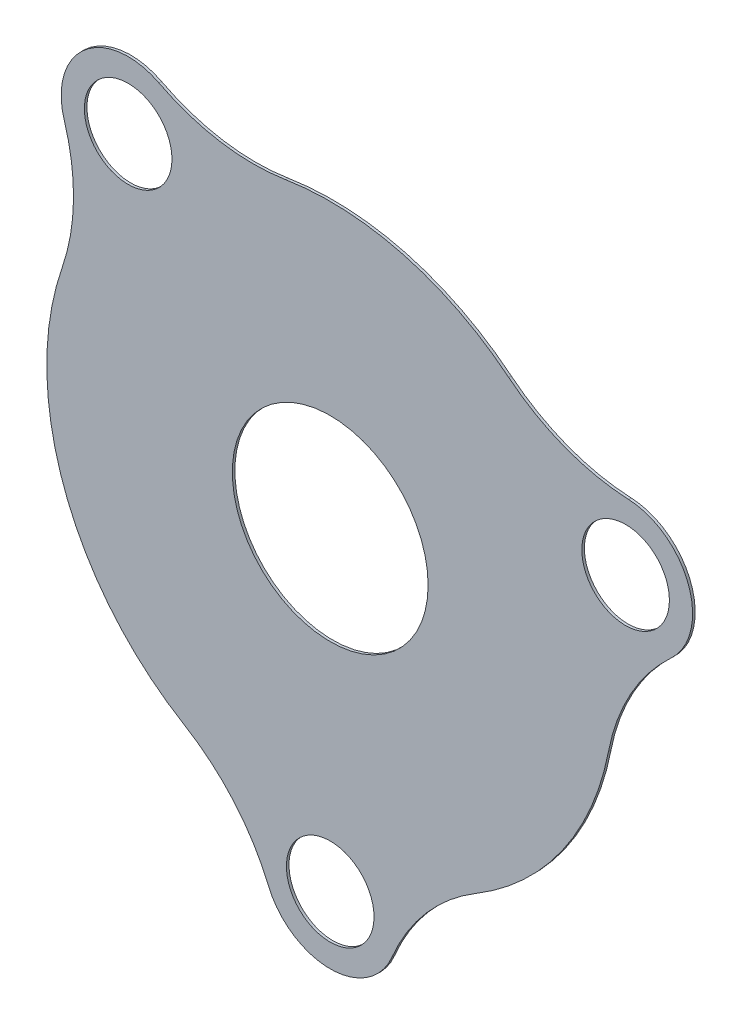
ISO-10303-21;
HEADER;
FILE_DESCRIPTION(('STEP AP214'),'2;1');
FILE_NAME('part.step','',(''),(''),'','','');
FILE_SCHEMA(('AUTOMOTIVE_DESIGN { 1 0 10303 214 1 1 1 1 }'));
ENDSEC;
DATA;
#1=APPLICATION_CONTEXT('core data for automotive mechanical design processes');
#2=APPLICATION_PROTOCOL_DEFINITION('international standard','automotive_design',2000,#1);
#3=PRODUCT_CONTEXT('',#1,'mechanical');
#4=PRODUCT('Part','Part','',(#3));
#5=PRODUCT_RELATED_PRODUCT_CATEGORY('part','',(#4));
#6=PRODUCT_DEFINITION_FORMATION('','',#4);
#7=PRODUCT_DEFINITION_CONTEXT('part definition',#1,'design');
#8=PRODUCT_DEFINITION('design','',#6,#7);
#9=PRODUCT_DEFINITION_SHAPE('','',#8);
#10=(LENGTH_UNIT() NAMED_UNIT(*) SI_UNIT(.MILLI.,.METRE.));
#11=(NAMED_UNIT(*) PLANE_ANGLE_UNIT() SI_UNIT($,.RADIAN.));
#12=(NAMED_UNIT(*) SI_UNIT($,.STERADIAN.) SOLID_ANGLE_UNIT());
#13=UNCERTAINTY_MEASURE_WITH_UNIT(LENGTH_MEASURE(1.E-05),#10,'distance_accuracy_value','');
#14=(GEOMETRIC_REPRESENTATION_CONTEXT(3) GLOBAL_UNCERTAINTY_ASSIGNED_CONTEXT((#13)) GLOBAL_UNIT_ASSIGNED_CONTEXT((#10,
#11,#12)) REPRESENTATION_CONTEXT('',''));
#15=CARTESIAN_POINT('',(0.,0.,0.));
#16=DIRECTION('',(0.,0.,1.));
#17=DIRECTION('',(1.,0.,0.));
#18=AXIS2_PLACEMENT_3D('',#15,#16,#17);
#19=CARTESIAN_POINT('',(-24.4477196009052,-40.7254098360657,0.5));
#20=DIRECTION('',(0.,0.,1.));
#21=DIRECTION('',(1.,0.,0.));
#22=AXIS2_PLACEMENT_3D('',#19,#20,#21);
#23=PLANE('',#22);
#24=CARTESIAN_POINT('',(0.,-60.9999999999992,0.5));
#25=DIRECTION('',(0.,0.,1.));
#26=DIRECTION('',(1.,0.,0.));
#27=AXIS2_PLACEMENT_3D('',#24,#25,#26);
#28=CIRCLE('',#27,8.50000000000002);
#29=CARTESIAN_POINT('',(8.50000000000003,-60.9999999999992,0.5));
#30=VERTEX_POINT('',#29);
#31=EDGE_CURVE('E299',#30,#30,#28,.T.);
#32=ORIENTED_EDGE('',*,*,#31,.F.);
#33=EDGE_LOOP('',(#32));
#34=FACE_BOUND('',#33,.T.);
#35=CARTESIAN_POINT('',(57.3212498679402,20.863228742866,0.5));
#36=DIRECTION('',(0.,0.,1.));
#37=DIRECTION('',(1.,0.,0.));
#38=AXIS2_PLACEMENT_3D('',#35,#36,#37);
#39=CIRCLE('',#38,8.50000000000002);
#40=CARTESIAN_POINT('',(65.8212498679402,20.863228742866,0.5));
#41=VERTEX_POINT('',#40);
#42=EDGE_CURVE('E166',#41,#41,#39,.T.);
#43=ORIENTED_EDGE('',*,*,#42,.F.);
#44=EDGE_LOOP('',(#43));
#45=FACE_BOUND('',#44,.T.);
#46=CARTESIAN_POINT('',(-48.8954392018104,-81.4508196721313,0.5));
#47=DIRECTION('',(0.,0.,-1.));
#48=DIRECTION('',(1.,0.,0.));
#49=AXIS2_PLACEMENT_3D('',#46,#47,#48);
#50=CIRCLE('',#49,40.);
#51=CARTESIAN_POINT('',(-28.3078858536797,-47.155737704918,0.5));
#52=VERTEX_POINT('',#51);
#53=CARTESIAN_POINT('',(-11.9932209362931,-66.0162387875033,0.5));
#54=VERTEX_POINT('',#53);
#55=EDGE_CURVE('E185',#52,#54,#50,.T.);
#56=ORIENTED_EDGE('',*,*,#55,.T.);
#57=CARTESIAN_POINT('',(0.,-60.9999999999992,0.5));
#58=DIRECTION('',(0.,0.,1.));
#59=DIRECTION('',(1.,0.,0.));
#60=AXIS2_PLACEMENT_3D('',#57,#58,#59);
#61=CIRCLE('',#60,13.);
#62=CARTESIAN_POINT('',(11.9932209362932,-66.0162387875032,0.5));
#63=VERTEX_POINT('',#62);
#64=EDGE_CURVE('E113',#54,#63,#61,.T.);
#65=ORIENTED_EDGE('',*,*,#64,.T.);
#66=CARTESIAN_POINT('',(48.8954392018111,-81.4508196721309,0.5));
#67=DIRECTION('',(0.,0.,-1.));
#68=DIRECTION('',(1.,0.,0.));
#69=AXIS2_PLACEMENT_3D('',#66,#67,#68);
#70=CIRCLE('',#69,40.0000000000005);
#71=CARTESIAN_POINT('',(28.3078858536798,-47.1557377049174,0.5));
#72=VERTEX_POINT('',#71);
#73=EDGE_CURVE('E212',#63,#72,#70,.T.);
#74=ORIENTED_EDGE('',*,*,#73,.T.);
#75=CARTESIAN_POINT('',(0.,0.,0.5));
#76=DIRECTION('',(0.,0.,1.));
#77=DIRECTION('',(1.,0.,0.));
#78=AXIS2_PLACEMENT_3D('',#75,#76,#77);
#79=CIRCLE('',#78,54.9999999999995);
#80=CARTESIAN_POINT('',(53.9937659259491,-10.4724992782891,0.5));
#81=VERTEX_POINT('',#80);
#82=EDGE_CURVE('E231',#72,#81,#79,.T.);
#83=ORIENTED_EDGE('',*,*,#82,.T.);
#84=CARTESIAN_POINT('',(93.2619593266404,-18.0888623897722,0.5));
#85=DIRECTION('',(0.,0.,-1.));
#86=DIRECTION('',(1.,0.,0.));
#87=AXIS2_PLACEMENT_3D('',#84,#85,#86);
#88=CIRCLE('',#87,40.0000000000005);
#89=CARTESIAN_POINT('',(66.136895584225,11.3089422386341,0.5));
#90=VERTEX_POINT('',#89);
#91=EDGE_CURVE('E228',#81,#90,#88,.T.);
#92=ORIENTED_EDGE('',*,*,#91,.T.);
#93=CARTESIAN_POINT('',(57.3212498679402,20.863228742866,0.5));
#94=DIRECTION('',(0.,0.,1.));
#95=DIRECTION('',(1.,0.,0.));
#96=AXIS2_PLACEMENT_3D('',#93,#94,#95);
#97=CIRCLE('',#96,13.);
#98=CARTESIAN_POINT('',(57.9330492970901,33.8488246652136,0.5));
#99=VERTEX_POINT('',#98);
#100=EDGE_CURVE('E230',#90,#99,#97,.T.);
#101=ORIENTED_EDGE('',*,*,#100,.T.);
#102=CARTESIAN_POINT('',(59.8155090790899,73.8045044262838,0.5));
#103=DIRECTION('',(0.,0.,-1.));
#104=DIRECTION('',(1.,0.,0.));
#105=AXIS2_PLACEMENT_3D('',#102,#103,#104);
#106=CIRCLE('',#105,40.0000000000005);
#107=CARTESIAN_POINT('',(34.6300315721044,42.7289236152166,0.5));
#108=VERTEX_POINT('',#107);
#109=EDGE_CURVE('E233',#99,#108,#106,.T.);
#110=ORIENTED_EDGE('',*,*,#109,.T.);
#111=CARTESIAN_POINT('',(0.,0.,0.5));
#112=DIRECTION('',(0.,0.,1.));
#113=DIRECTION('',(1.,0.,0.));
#114=AXIS2_PLACEMENT_3D('',#111,#112,#113);
#115=CIRCLE('',#114,54.9999999999996);
#116=CARTESIAN_POINT('',(-8.62602526769196,54.3193491131945,0.5));
#117=VERTEX_POINT('',#116);
#118=EDGE_CURVE('E239',#108,#117,#115,.T.);
#119=ORIENTED_EDGE('',*,*,#118,.T.);
#120=CARTESIAN_POINT('',(-14.8994981896499,93.8243302864276,0.5));
#121=DIRECTION('',(0.,0.,-1.));
#122=DIRECTION('',(1.,0.,0.));
#123=AXIS2_PLACEMENT_3D('',#120,#121,#122);
#124=CIRCLE('',#123,40.0000000000005);
#125=CARTESIAN_POINT('',(-33.2470800773702,58.2804666968649,0.5));
#126=VERTEX_POINT('',#125);
#127=EDGE_CURVE('E144',#117,#126,#124,.T.);
#128=ORIENTED_EDGE('',*,*,#127,.T.);
#129=CARTESIAN_POINT('',(-39.2100441908792,46.7287110302572,0.5));
#130=DIRECTION('',(0.,0.,1.));
#131=DIRECTION('',(1.,0.,0.));
#132=AXIS2_PLACEMENT_3D('',#129,#130,#131);
#133=CIRCLE('',#132,13.);
#134=CARTESIAN_POINT('',(-51.6217605840612,42.8622790606998,0.5));
#135=VERTEX_POINT('',#134);
#136=EDGE_CURVE('E138',#126,#135,#133,.T.);
#137=ORIENTED_EDGE('',*,*,#136,.T.);
#138=CARTESIAN_POINT('',(-89.8116571784681,30.9655653082154,0.5));
#139=DIRECTION('',(0.,0.,-1.));
#140=DIRECTION('',(1.,0.,0.));
#141=AXIS2_PLACEMENT_3D('',#138,#139,#140);
#142=CIRCLE('',#141,40.0000000000005);
#143=CARTESIAN_POINT('',(-51.9962225770074,17.9274325468614,0.5));
#144=VERTEX_POINT('',#143);
#145=EDGE_CURVE('E142',#135,#144,#142,.T.);
#146=ORIENTED_EDGE('',*,*,#145,.T.);
#147=CARTESIAN_POINT('',(0.,0.,0.5));
#148=DIRECTION('',(0.,0.,1.));
#149=DIRECTION('',(1.,0.,0.));
#150=AXIS2_PLACEMENT_3D('',#147,#148,#149);
#151=CIRCLE('',#150,54.9999999999998);
#152=EDGE_CURVE('E58',#144,#52,#151,.T.);
#153=ORIENTED_EDGE('',*,*,#152,.T.);
#154=EDGE_LOOP('',(#56,#65,#74,#83,#92,#101,#110,#119,#128,#137,#146,#153));
#155=FACE_BOUND('',#154,.T.);
#156=CARTESIAN_POINT('',(-39.2100441908792,46.7287110302572,0.5));
#157=DIRECTION('',(0.,0.,1.));
#158=DIRECTION('',(1.,0.,0.));
#159=AXIS2_PLACEMENT_3D('',#156,#157,#158);
#160=CIRCLE('',#159,8.50000000000002);
#161=CARTESIAN_POINT('',(-30.7100441908792,46.7287110302572,0.5));
#162=VERTEX_POINT('',#161);
#163=EDGE_CURVE('E305',#162,#162,#160,.T.);
#164=ORIENTED_EDGE('',*,*,#163,.F.);
#165=EDGE_LOOP('',(#164));
#166=FACE_BOUND('',#165,.T.);
#167=CARTESIAN_POINT('',(0.,0.,0.5));
#168=DIRECTION('',(0.,0.,1.));
#169=DIRECTION('',(1.,0.,0.));
#170=AXIS2_PLACEMENT_3D('',#167,#168,#169);
#171=CIRCLE('',#170,19.);
#172=CARTESIAN_POINT('',(19.,0.,0.5));
#173=VERTEX_POINT('',#172);
#174=EDGE_CURVE('E290',#173,#173,#171,.T.);
#175=ORIENTED_EDGE('',*,*,#174,.F.);
#176=EDGE_LOOP('',(#175));
#177=FACE_BOUND('',#176,.T.);
#178=ADVANCED_FACE('F41',(#34,#45,#155,#166,#177),#23,.T.);
#179=CARTESIAN_POINT('',(-24.4477196009052,-40.7254098360657,0.));
#180=DIRECTION('',(0.,0.,1.));
#181=DIRECTION('',(1.,0.,0.));
#182=AXIS2_PLACEMENT_3D('',#179,#180,#181);
#183=PLANE('',#182);
#184=CARTESIAN_POINT('',(-48.8954392018104,-81.4508196721313,0.));
#185=DIRECTION('',(0.,0.,-1.));
#186=DIRECTION('',(1.,0.,0.));
#187=AXIS2_PLACEMENT_3D('',#184,#185,#186);
#188=CIRCLE('',#187,40.);
#189=CARTESIAN_POINT('',(-28.3078858536797,-47.155737704918,0.));
#190=VERTEX_POINT('',#189);
#191=CARTESIAN_POINT('',(-11.9932209362931,-66.0162387875033,0.));
#192=VERTEX_POINT('',#191);
#193=EDGE_CURVE('E162',#190,#192,#188,.T.);
#194=ORIENTED_EDGE('',*,*,#193,.F.);
#195=CARTESIAN_POINT('',(0.,0.,0.));
#196=DIRECTION('',(0.,0.,1.));
#197=DIRECTION('',(1.,0.,0.));
#198=AXIS2_PLACEMENT_3D('',#195,#196,#197);
#199=CIRCLE('',#198,54.9999999999998);
#200=CARTESIAN_POINT('',(-51.9962225770074,17.9274325468614,0.));
#201=VERTEX_POINT('',#200);
#202=EDGE_CURVE('E105',#201,#190,#199,.T.);
#203=ORIENTED_EDGE('',*,*,#202,.F.);
#204=CARTESIAN_POINT('',(-89.8116571784681,30.9655653082154,0.));
#205=DIRECTION('',(0.,0.,-1.));
#206=DIRECTION('',(1.,0.,0.));
#207=AXIS2_PLACEMENT_3D('',#204,#205,#206);
#208=CIRCLE('',#207,40.0000000000005);
#209=CARTESIAN_POINT('',(-51.6217605840612,42.8622790606998,0.));
#210=VERTEX_POINT('',#209);
#211=EDGE_CURVE('E99',#210,#201,#208,.T.);
#212=ORIENTED_EDGE('',*,*,#211,.F.);
#213=CARTESIAN_POINT('',(-39.2100441908792,46.7287110302572,0.));
#214=DIRECTION('',(0.,0.,1.));
#215=DIRECTION('',(1.,0.,0.));
#216=AXIS2_PLACEMENT_3D('',#213,#214,#215);
#217=CIRCLE('',#216,13.);
#218=CARTESIAN_POINT('',(-33.2470800773702,58.2804666968649,0.));
#219=VERTEX_POINT('',#218);
#220=EDGE_CURVE('E152',#219,#210,#217,.T.);
#221=ORIENTED_EDGE('',*,*,#220,.F.);
#222=CARTESIAN_POINT('',(-14.8994981896499,93.8243302864276,0.));
#223=DIRECTION('',(0.,0.,-1.));
#224=DIRECTION('',(1.,0.,0.));
#225=AXIS2_PLACEMENT_3D('',#222,#223,#224);
#226=CIRCLE('',#225,40.0000000000005);
#227=CARTESIAN_POINT('',(-8.62602526769196,54.3193491131945,0.));
#228=VERTEX_POINT('',#227);
#229=EDGE_CURVE('E180',#228,#219,#226,.T.);
#230=ORIENTED_EDGE('',*,*,#229,.F.);
#231=CARTESIAN_POINT('',(0.,0.,0.));
#232=DIRECTION('',(0.,0.,1.));
#233=DIRECTION('',(1.,0.,0.));
#234=AXIS2_PLACEMENT_3D('',#231,#232,#233);
#235=CIRCLE('',#234,54.9999999999996);
#236=CARTESIAN_POINT('',(34.6300315721044,42.7289236152166,0.));
#237=VERTEX_POINT('',#236);
#238=EDGE_CURVE('E178',#237,#228,#235,.T.);
#239=ORIENTED_EDGE('',*,*,#238,.F.);
#240=CARTESIAN_POINT('',(59.8155090790899,73.8045044262838,0.));
#241=DIRECTION('',(0.,0.,-1.));
#242=DIRECTION('',(1.,0.,0.));
#243=AXIS2_PLACEMENT_3D('',#240,#241,#242);
#244=CIRCLE('',#243,40.0000000000005);
#245=CARTESIAN_POINT('',(57.9330492970901,33.8488246652136,0.));
#246=VERTEX_POINT('',#245);
#247=EDGE_CURVE('E176',#246,#237,#244,.T.);
#248=ORIENTED_EDGE('',*,*,#247,.F.);
#249=CARTESIAN_POINT('',(57.3212498679402,20.863228742866,0.));
#250=DIRECTION('',(0.,0.,1.));
#251=DIRECTION('',(1.,0.,0.));
#252=AXIS2_PLACEMENT_3D('',#249,#250,#251);
#253=CIRCLE('',#252,13.);
#254=CARTESIAN_POINT('',(66.136895584225,11.3089422386341,0.));
#255=VERTEX_POINT('',#254);
#256=EDGE_CURVE('E174',#255,#246,#253,.T.);
#257=ORIENTED_EDGE('',*,*,#256,.F.);
#258=CARTESIAN_POINT('',(93.2619593266404,-18.0888623897722,0.));
#259=DIRECTION('',(0.,0.,-1.));
#260=DIRECTION('',(1.,0.,0.));
#261=AXIS2_PLACEMENT_3D('',#258,#259,#260);
#262=CIRCLE('',#261,40.0000000000005);
#263=CARTESIAN_POINT('',(53.9937659259491,-10.4724992782891,0.));
#264=VERTEX_POINT('',#263);
#265=EDGE_CURVE('E172',#264,#255,#262,.T.);
#266=ORIENTED_EDGE('',*,*,#265,.F.);
#267=CARTESIAN_POINT('',(0.,0.,0.));
#268=DIRECTION('',(0.,0.,1.));
#269=DIRECTION('',(1.,0.,0.));
#270=AXIS2_PLACEMENT_3D('',#267,#268,#269);
#271=CIRCLE('',#270,54.9999999999995);
#272=CARTESIAN_POINT('',(28.3078858536798,-47.1557377049174,0.));
#273=VERTEX_POINT('',#272);
#274=EDGE_CURVE('E170',#273,#264,#271,.T.);
#275=ORIENTED_EDGE('',*,*,#274,.F.);
#276=CARTESIAN_POINT('',(48.8954392018111,-81.4508196721309,0.));
#277=DIRECTION('',(0.,0.,-1.));
#278=DIRECTION('',(1.,0.,0.));
#279=AXIS2_PLACEMENT_3D('',#276,#277,#278);
#280=CIRCLE('',#279,40.0000000000005);
#281=CARTESIAN_POINT('',(11.9932209362932,-66.0162387875032,0.));
#282=VERTEX_POINT('',#281);
#283=EDGE_CURVE('E168',#282,#273,#280,.T.);
#284=ORIENTED_EDGE('',*,*,#283,.F.);
#285=CARTESIAN_POINT('',(0.,-60.9999999999992,0.));
#286=DIRECTION('',(0.,0.,1.));
#287=DIRECTION('',(1.,0.,0.));
#288=AXIS2_PLACEMENT_3D('',#285,#286,#287);
#289=CIRCLE('',#288,13.);
#290=EDGE_CURVE('E165',#192,#282,#289,.T.);
#291=ORIENTED_EDGE('',*,*,#290,.F.);
#292=EDGE_LOOP('',(#194,#203,#212,#221,#230,#239,#248,#257,#266,#275,#284,#291));
#293=FACE_BOUND('',#292,.T.);
#294=CARTESIAN_POINT('',(57.3212498679402,20.863228742866,0.));
#295=DIRECTION('',(0.,0.,1.));
#296=DIRECTION('',(1.,0.,0.));
#297=AXIS2_PLACEMENT_3D('',#294,#295,#296);
#298=CIRCLE('',#297,8.50000000000002);
#299=CARTESIAN_POINT('',(65.8212498679402,20.863228742866,0.));
#300=VERTEX_POINT('',#299);
#301=EDGE_CURVE('E308',#300,#300,#298,.T.);
#302=ORIENTED_EDGE('',*,*,#301,.T.);
#303=EDGE_LOOP('',(#302));
#304=FACE_BOUND('',#303,.T.);
#305=CARTESIAN_POINT('',(-39.2100441908792,46.7287110302572,0.));
#306=DIRECTION('',(0.,0.,1.));
#307=DIRECTION('',(1.,0.,0.));
#308=AXIS2_PLACEMENT_3D('',#305,#306,#307);
#309=CIRCLE('',#308,8.50000000000002);
#310=CARTESIAN_POINT('',(-30.7100441908792,46.7287110302572,0.));
#311=VERTEX_POINT('',#310);
#312=EDGE_CURVE('E302',#311,#311,#309,.T.);
#313=ORIENTED_EDGE('',*,*,#312,.T.);
#314=EDGE_LOOP('',(#313));
#315=FACE_BOUND('',#314,.T.);
#316=CARTESIAN_POINT('',(0.,-60.9999999999992,0.));
#317=DIRECTION('',(0.,0.,1.));
#318=DIRECTION('',(1.,0.,0.));
#319=AXIS2_PLACEMENT_3D('',#316,#317,#318);
#320=CIRCLE('',#319,8.50000000000002);
#321=CARTESIAN_POINT('',(8.50000000000003,-60.9999999999992,0.));
#322=VERTEX_POINT('',#321);
#323=EDGE_CURVE('E296',#322,#322,#320,.T.);
#324=ORIENTED_EDGE('',*,*,#323,.T.);
#325=EDGE_LOOP('',(#324));
#326=FACE_BOUND('',#325,.T.);
#327=CARTESIAN_POINT('',(0.,0.,0.));
#328=DIRECTION('',(0.,0.,1.));
#329=DIRECTION('',(1.,0.,0.));
#330=AXIS2_PLACEMENT_3D('',#327,#328,#329);
#331=CIRCLE('',#330,19.);
#332=CARTESIAN_POINT('',(19.,0.,0.));
#333=VERTEX_POINT('',#332);
#334=EDGE_CURVE('E293',#333,#333,#331,.T.);
#335=ORIENTED_EDGE('',*,*,#334,.T.);
#336=EDGE_LOOP('',(#335));
#337=FACE_BOUND('',#336,.T.);
#338=ADVANCED_FACE('F216',(#293,#304,#315,#326,#337),#183,.F.);
#339=CARTESIAN_POINT('',(-48.8954392018104,-81.4508196721313,0.5));
#340=DIRECTION('',(0.,0.,-1.));
#341=DIRECTION('',(-1.,0.,0.));
#342=AXIS2_PLACEMENT_3D('',#339,#340,#341);
#343=CYLINDRICAL_SURFACE('',#342,40.);
#344=ORIENTED_EDGE('',*,*,#193,.T.);
#345=DIRECTION('',(0.,0.,-1.));
#346=VECTOR('',#345,1.);
#347=CARTESIAN_POINT('',(-11.9932209362931,-66.0162387875033,0.5));
#348=LINE('',#347,#346);
#349=EDGE_CURVE('E11',#54,#192,#348,.T.);
#350=ORIENTED_EDGE('',*,*,#349,.F.);
#351=ORIENTED_EDGE('',*,*,#55,.F.);
#352=DIRECTION('',(0.,0.,-1.));
#353=VECTOR('',#352,1.);
#354=CARTESIAN_POINT('',(-28.3078858536797,-47.155737704918,0.5));
#355=LINE('',#354,#353);
#356=EDGE_CURVE('E158',#52,#190,#355,.T.);
#357=ORIENTED_EDGE('',*,*,#356,.T.);
#358=EDGE_LOOP('',(#344,#350,#351,#357));
#359=FACE_BOUND('',#358,.T.);
#360=ADVANCED_FACE('F43',(#359),#343,.F.);
#361=CARTESIAN_POINT('',(0.,-60.9999999999992,0.5));
#362=DIRECTION('',(0.,0.,-1.));
#363=DIRECTION('',(-1.,0.,0.));
#364=AXIS2_PLACEMENT_3D('',#361,#362,#363);
#365=CYLINDRICAL_SURFACE('',#364,13.);
#366=ORIENTED_EDGE('',*,*,#290,.T.);
#367=DIRECTION('',(0.,0.,-1.));
#368=VECTOR('',#367,1.);
#369=CARTESIAN_POINT('',(11.9932209362932,-66.0162387875032,0.5));
#370=LINE('',#369,#368);
#371=EDGE_CURVE('E50',#63,#282,#370,.T.);
#372=ORIENTED_EDGE('',*,*,#371,.F.);
#373=ORIENTED_EDGE('',*,*,#64,.F.);
#374=ORIENTED_EDGE('',*,*,#349,.T.);
#375=EDGE_LOOP('',(#366,#372,#373,#374));
#376=FACE_BOUND('',#375,.T.);
#377=ADVANCED_FACE('F422',(#376),#365,.T.);
#378=CARTESIAN_POINT('',(48.8954392018111,-81.4508196721309,0.5));
#379=DIRECTION('',(0.,0.,-1.));
#380=DIRECTION('',(-1.,0.,0.));
#381=AXIS2_PLACEMENT_3D('',#378,#379,#380);
#382=CYLINDRICAL_SURFACE('',#381,40.0000000000005);
#383=ORIENTED_EDGE('',*,*,#283,.T.);
#384=DIRECTION('',(0.,0.,-1.));
#385=VECTOR('',#384,1.);
#386=CARTESIAN_POINT('',(28.3078858536798,-47.1557377049174,0.5));
#387=LINE('',#386,#385);
#388=EDGE_CURVE('E204',#72,#273,#387,.T.);
#389=ORIENTED_EDGE('',*,*,#388,.F.);
#390=ORIENTED_EDGE('',*,*,#73,.F.);
#391=ORIENTED_EDGE('',*,*,#371,.T.);
#392=EDGE_LOOP('',(#383,#389,#390,#391));
#393=FACE_BOUND('',#392,.T.);
#394=ADVANCED_FACE('F210',(#393),#382,.F.);
#395=CARTESIAN_POINT('',(0.,0.,0.5));
#396=DIRECTION('',(0.,0.,-1.));
#397=DIRECTION('',(-1.,0.,0.));
#398=AXIS2_PLACEMENT_3D('',#395,#396,#397);
#399=CYLINDRICAL_SURFACE('',#398,54.9999999999995);
#400=ORIENTED_EDGE('',*,*,#274,.T.);
#401=DIRECTION('',(0.,0.,-1.));
#402=VECTOR('',#401,1.);
#403=CARTESIAN_POINT('',(53.9937659259491,-10.4724992782891,0.5));
#404=LINE('',#403,#402);
#405=EDGE_CURVE('E201',#81,#264,#404,.T.);
#406=ORIENTED_EDGE('',*,*,#405,.F.);
#407=ORIENTED_EDGE('',*,*,#82,.F.);
#408=ORIENTED_EDGE('',*,*,#388,.T.);
#409=EDGE_LOOP('',(#400,#406,#407,#408));
#410=FACE_BOUND('',#409,.T.);
#411=ADVANCED_FACE('F222',(#410),#399,.T.);
#412=CARTESIAN_POINT('',(93.2619593266404,-18.0888623897722,0.5));
#413=DIRECTION('',(0.,0.,-1.));
#414=DIRECTION('',(-1.,0.,0.));
#415=AXIS2_PLACEMENT_3D('',#412,#413,#414);
#416=CYLINDRICAL_SURFACE('',#415,40.0000000000005);
#417=ORIENTED_EDGE('',*,*,#265,.T.);
#418=DIRECTION('',(0.,0.,-1.));
#419=VECTOR('',#418,1.);
#420=CARTESIAN_POINT('',(66.136895584225,11.3089422386341,0.5));
#421=LINE('',#420,#419);
#422=EDGE_CURVE('E198',#90,#255,#421,.T.);
#423=ORIENTED_EDGE('',*,*,#422,.F.);
#424=ORIENTED_EDGE('',*,*,#91,.F.);
#425=ORIENTED_EDGE('',*,*,#405,.T.);
#426=EDGE_LOOP('',(#417,#423,#424,#425));
#427=FACE_BOUND('',#426,.T.);
#428=ADVANCED_FACE('F226',(#427),#416,.F.);
#429=CARTESIAN_POINT('',(57.3212498679402,20.863228742866,0.5));
#430=DIRECTION('',(0.,0.,-1.));
#431=DIRECTION('',(-1.,0.,0.));
#432=AXIS2_PLACEMENT_3D('',#429,#430,#431);
#433=CYLINDRICAL_SURFACE('',#432,13.);
#434=ORIENTED_EDGE('',*,*,#256,.T.);
#435=DIRECTION('',(0.,0.,-1.));
#436=VECTOR('',#435,1.);
#437=CARTESIAN_POINT('',(57.9330492970901,33.8488246652136,0.5));
#438=LINE('',#437,#436);
#439=EDGE_CURVE('E195',#99,#246,#438,.T.);
#440=ORIENTED_EDGE('',*,*,#439,.F.);
#441=ORIENTED_EDGE('',*,*,#100,.F.);
#442=ORIENTED_EDGE('',*,*,#422,.T.);
#443=EDGE_LOOP('',(#434,#440,#441,#442));
#444=FACE_BOUND('',#443,.T.);
#445=ADVANCED_FACE('F387',(#444),#433,.T.);
#446=CARTESIAN_POINT('',(59.8155090790899,73.8045044262838,0.5));
#447=DIRECTION('',(0.,0.,-1.));
#448=DIRECTION('',(-1.,0.,0.));
#449=AXIS2_PLACEMENT_3D('',#446,#447,#448);
#450=CYLINDRICAL_SURFACE('',#449,40.0000000000005);
#451=ORIENTED_EDGE('',*,*,#247,.T.);
#452=DIRECTION('',(0.,0.,-1.));
#453=VECTOR('',#452,1.);
#454=CARTESIAN_POINT('',(34.6300315721044,42.7289236152166,0.5));
#455=LINE('',#454,#453);
#456=EDGE_CURVE('E192',#108,#237,#455,.T.);
#457=ORIENTED_EDGE('',*,*,#456,.F.);
#458=ORIENTED_EDGE('',*,*,#109,.F.);
#459=ORIENTED_EDGE('',*,*,#439,.T.);
#460=EDGE_LOOP('',(#451,#457,#458,#459));
#461=FACE_BOUND('',#460,.T.);
#462=ADVANCED_FACE('F378',(#461),#450,.F.);
#463=CARTESIAN_POINT('',(0.,0.,0.5));
#464=DIRECTION('',(0.,0.,-1.));
#465=DIRECTION('',(-1.,0.,0.));
#466=AXIS2_PLACEMENT_3D('',#463,#464,#465);
#467=CYLINDRICAL_SURFACE('',#466,54.9999999999996);
#468=ORIENTED_EDGE('',*,*,#238,.T.);
#469=DIRECTION('',(0.,0.,-1.));
#470=VECTOR('',#469,1.);
#471=CARTESIAN_POINT('',(-8.62602526769196,54.3193491131945,0.5));
#472=LINE('',#471,#470);
#473=EDGE_CURVE('E189',#117,#228,#472,.T.);
#474=ORIENTED_EDGE('',*,*,#473,.F.);
#475=ORIENTED_EDGE('',*,*,#118,.F.);
#476=ORIENTED_EDGE('',*,*,#456,.T.);
#477=EDGE_LOOP('',(#468,#474,#475,#476));
#478=FACE_BOUND('',#477,.T.);
#479=ADVANCED_FACE('F245',(#478),#467,.T.);
#480=CARTESIAN_POINT('',(-14.8994981896499,93.8243302864276,0.5));
#481=DIRECTION('',(0.,0.,-1.));
#482=DIRECTION('',(-1.,0.,0.));
#483=AXIS2_PLACEMENT_3D('',#480,#481,#482);
#484=CYLINDRICAL_SURFACE('',#483,40.0000000000005);
#485=ORIENTED_EDGE('',*,*,#229,.T.);
#486=DIRECTION('',(0.,0.,-1.));
#487=VECTOR('',#486,1.);
#488=CARTESIAN_POINT('',(-33.2470800773702,58.2804666968649,0.5));
#489=LINE('',#488,#487);
#490=EDGE_CURVE('E153',#126,#219,#489,.T.);
#491=ORIENTED_EDGE('',*,*,#490,.F.);
#492=ORIENTED_EDGE('',*,*,#127,.F.);
#493=ORIENTED_EDGE('',*,*,#473,.T.);
#494=EDGE_LOOP('',(#485,#491,#492,#493));
#495=FACE_BOUND('',#494,.T.);
#496=ADVANCED_FACE('F249',(#495),#484,.F.);
#497=CARTESIAN_POINT('',(-39.2100441908792,46.7287110302572,0.5));
#498=DIRECTION('',(0.,0.,-1.));
#499=DIRECTION('',(-1.,0.,0.));
#500=AXIS2_PLACEMENT_3D('',#497,#498,#499);
#501=CYLINDRICAL_SURFACE('',#500,13.);
#502=ORIENTED_EDGE('',*,*,#220,.T.);
#503=DIRECTION('',(0.,0.,-1.));
#504=VECTOR('',#503,1.);
#505=CARTESIAN_POINT('',(-51.6217605840612,42.8622790606998,0.5));
#506=LINE('',#505,#504);
#507=EDGE_CURVE('E149',#135,#210,#506,.T.);
#508=ORIENTED_EDGE('',*,*,#507,.F.);
#509=ORIENTED_EDGE('',*,*,#136,.F.);
#510=ORIENTED_EDGE('',*,*,#490,.T.);
#511=EDGE_LOOP('',(#502,#508,#509,#510));
#512=FACE_BOUND('',#511,.T.);
#513=ADVANCED_FACE('F150',(#512),#501,.T.);
#514=CARTESIAN_POINT('',(-89.8116571784681,30.9655653082154,0.5));
#515=DIRECTION('',(0.,0.,-1.));
#516=DIRECTION('',(-1.,0.,0.));
#517=AXIS2_PLACEMENT_3D('',#514,#515,#516);
#518=CYLINDRICAL_SURFACE('',#517,40.0000000000005);
#519=ORIENTED_EDGE('',*,*,#211,.T.);
#520=DIRECTION('',(0.,0.,-1.));
#521=VECTOR('',#520,1.);
#522=CARTESIAN_POINT('',(-51.9962225770074,17.9274325468614,0.5));
#523=LINE('',#522,#521);
#524=EDGE_CURVE('E154',#144,#201,#523,.T.);
#525=ORIENTED_EDGE('',*,*,#524,.F.);
#526=ORIENTED_EDGE('',*,*,#145,.F.);
#527=ORIENTED_EDGE('',*,*,#507,.T.);
#528=EDGE_LOOP('',(#519,#525,#526,#527));
#529=FACE_BOUND('',#528,.T.);
#530=ADVANCED_FACE('F156',(#529),#518,.F.);
#531=CARTESIAN_POINT('',(0.,0.,0.5));
#532=DIRECTION('',(0.,0.,-1.));
#533=DIRECTION('',(-1.,0.,0.));
#534=AXIS2_PLACEMENT_3D('',#531,#532,#533);
#535=CYLINDRICAL_SURFACE('',#534,54.9999999999998);
#536=ORIENTED_EDGE('',*,*,#202,.T.);
#537=ORIENTED_EDGE('',*,*,#356,.F.);
#538=ORIENTED_EDGE('',*,*,#152,.F.);
#539=ORIENTED_EDGE('',*,*,#524,.T.);
#540=EDGE_LOOP('',(#536,#537,#538,#539));
#541=FACE_BOUND('',#540,.T.);
#542=ADVANCED_FACE('F253',(#541),#535,.T.);
#543=CARTESIAN_POINT('',(57.3212498679402,20.863228742866,0.5));
#544=DIRECTION('',(0.,0.,-1.));
#545=DIRECTION('',(-1.,0.,0.));
#546=AXIS2_PLACEMENT_3D('',#543,#544,#545);
#547=CYLINDRICAL_SURFACE('',#546,8.50000000000002);
#548=ORIENTED_EDGE('',*,*,#42,.T.);
#549=EDGE_LOOP('',(#548));
#550=FACE_BOUND('',#549,.T.);
#551=ORIENTED_EDGE('',*,*,#301,.F.);
#552=EDGE_LOOP('',(#551));
#553=FACE_BOUND('',#552,.T.);
#554=ADVANCED_FACE('F255',(#550,#553),#547,.F.);
#555=CARTESIAN_POINT('',(-39.2100441908792,46.7287110302572,0.5));
#556=DIRECTION('',(0.,0.,-1.));
#557=DIRECTION('',(-1.,0.,0.));
#558=AXIS2_PLACEMENT_3D('',#555,#556,#557);
#559=CYLINDRICAL_SURFACE('',#558,8.50000000000002);
#560=ORIENTED_EDGE('',*,*,#163,.T.);
#561=EDGE_LOOP('',(#560));
#562=FACE_BOUND('',#561,.T.);
#563=ORIENTED_EDGE('',*,*,#312,.F.);
#564=EDGE_LOOP('',(#563));
#565=FACE_BOUND('',#564,.T.);
#566=ADVANCED_FACE('F261',(#562,#565),#559,.F.);
#567=CARTESIAN_POINT('',(0.,-60.9999999999992,0.5));
#568=DIRECTION('',(0.,0.,-1.));
#569=DIRECTION('',(-1.,0.,0.));
#570=AXIS2_PLACEMENT_3D('',#567,#568,#569);
#571=CYLINDRICAL_SURFACE('',#570,8.50000000000002);
#572=ORIENTED_EDGE('',*,*,#31,.T.);
#573=EDGE_LOOP('',(#572));
#574=FACE_BOUND('',#573,.T.);
#575=ORIENTED_EDGE('',*,*,#323,.F.);
#576=EDGE_LOOP('',(#575));
#577=FACE_BOUND('',#576,.T.);
#578=ADVANCED_FACE('F277',(#574,#577),#571,.F.);
#579=CARTESIAN_POINT('',(0.,0.,0.5));
#580=DIRECTION('',(0.,0.,-1.));
#581=DIRECTION('',(-1.,0.,0.));
#582=AXIS2_PLACEMENT_3D('',#579,#580,#581);
#583=CYLINDRICAL_SURFACE('',#582,19.);
#584=ORIENTED_EDGE('',*,*,#174,.T.);
#585=EDGE_LOOP('',(#584));
#586=FACE_BOUND('',#585,.T.);
#587=ORIENTED_EDGE('',*,*,#334,.F.);
#588=EDGE_LOOP('',(#587));
#589=FACE_BOUND('',#588,.T.);
#590=ADVANCED_FACE('F281',(#586,#589),#583,.F.);
#591=CLOSED_SHELL('',(#178,#338,#360,#377,#394,#411,#428,#445,#462,#479,#496,#513,#530,#542,
#554,#566,#578,#590));
#592=MANIFOLD_SOLID_BREP('B2',#591);
#593=ADVANCED_BREP_SHAPE_REPRESENTATION('',(#18,#592),#14);
#594=SHAPE_DEFINITION_REPRESENTATION(#9,#593);
ENDSEC;
END-ISO-10303-21;
